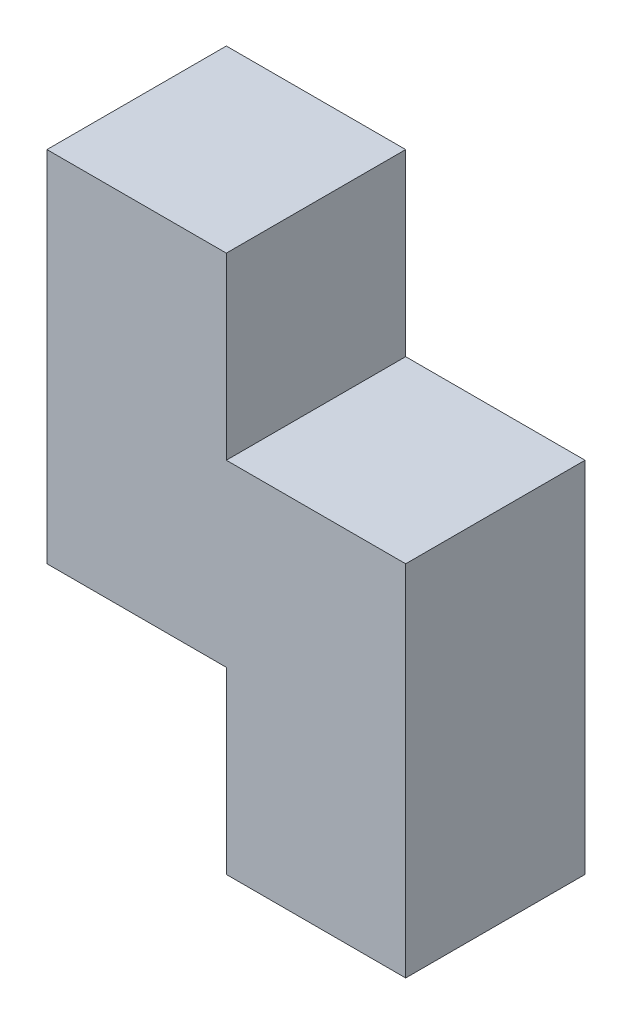
ISO-10303-21;
HEADER;
FILE_DESCRIPTION(('STEP AP214'),'2;1');
FILE_NAME('part.step','',(''),(''),'','','');
FILE_SCHEMA(('AUTOMOTIVE_DESIGN { 1 0 10303 214 1 1 1 1 }'));
ENDSEC;
DATA;
#1=APPLICATION_CONTEXT('core data for automotive mechanical design processes');
#2=APPLICATION_PROTOCOL_DEFINITION('international standard','automotive_design',2000,#1);
#3=PRODUCT_CONTEXT('',#1,'mechanical');
#4=PRODUCT('Part','Part','',(#3));
#5=PRODUCT_RELATED_PRODUCT_CATEGORY('part','',(#4));
#6=PRODUCT_DEFINITION_FORMATION('','',#4);
#7=PRODUCT_DEFINITION_CONTEXT('part definition',#1,'design');
#8=PRODUCT_DEFINITION('design','',#6,#7);
#9=PRODUCT_DEFINITION_SHAPE('','',#8);
#10=(LENGTH_UNIT() NAMED_UNIT(*) SI_UNIT(.MILLI.,.METRE.));
#11=(NAMED_UNIT(*) PLANE_ANGLE_UNIT() SI_UNIT($,.RADIAN.));
#12=(NAMED_UNIT(*) SI_UNIT($,.STERADIAN.) SOLID_ANGLE_UNIT());
#13=UNCERTAINTY_MEASURE_WITH_UNIT(LENGTH_MEASURE(1.E-05),#10,'distance_accuracy_value','');
#14=(GEOMETRIC_REPRESENTATION_CONTEXT(3) GLOBAL_UNCERTAINTY_ASSIGNED_CONTEXT((#13)) GLOBAL_UNIT_ASSIGNED_CONTEXT((#10,
#11,#12)) REPRESENTATION_CONTEXT('',''));
#15=CARTESIAN_POINT('',(0.,0.,0.));
#16=DIRECTION('',(0.,0.,1.));
#17=DIRECTION('',(1.,0.,0.));
#18=AXIS2_PLACEMENT_3D('',#15,#16,#17);
#19=CARTESIAN_POINT('',(19.888680700981,0.,30.));
#20=DIRECTION('',(-1.,0.,0.));
#21=DIRECTION('',(0.,0.,1.));
#22=AXIS2_PLACEMENT_3D('',#19,#20,#21);
#23=PLANE('',#22);
#24=DIRECTION('',(0.,1.,0.));
#25=VECTOR('',#24,1.);
#26=CARTESIAN_POINT('',(19.888680700981,0.,0.));
#27=LINE('',#26,#25);
#28=CARTESIAN_POINT('',(19.888680700981,0.,0.));
#29=VERTEX_POINT('',#28);
#30=CARTESIAN_POINT('',(19.888680700981,30.,0.));
#31=VERTEX_POINT('',#30);
#32=EDGE_CURVE('E148',#29,#31,#27,.T.);
#33=ORIENTED_EDGE('',*,*,#32,.T.);
#34=DIRECTION('',(0.,0.,-1.));
#35=VECTOR('',#34,1.);
#36=CARTESIAN_POINT('',(19.888680700981,30.,30.));
#37=LINE('',#36,#35);
#38=CARTESIAN_POINT('',(19.888680700981,30.,30.));
#39=VERTEX_POINT('',#38);
#40=EDGE_CURVE('E11',#39,#31,#37,.T.);
#41=ORIENTED_EDGE('',*,*,#40,.F.);
#42=DIRECTION('',(0.,1.,0.));
#43=VECTOR('',#42,1.);
#44=CARTESIAN_POINT('',(19.888680700981,0.,30.));
#45=LINE('',#44,#43);
#46=CARTESIAN_POINT('',(19.888680700981,0.,30.));
#47=VERTEX_POINT('',#46);
#48=EDGE_CURVE('E170',#47,#39,#45,.T.);
#49=ORIENTED_EDGE('',*,*,#48,.F.);
#50=DIRECTION('',(0.,0.,-1.));
#51=VECTOR('',#50,1.);
#52=CARTESIAN_POINT('',(19.888680700981,0.,30.));
#53=LINE('',#52,#51);
#54=EDGE_CURVE('E144',#47,#29,#53,.T.);
#55=ORIENTED_EDGE('',*,*,#54,.T.);
#56=EDGE_LOOP('',(#33,#41,#49,#55));
#57=FACE_BOUND('',#56,.T.);
#58=ADVANCED_FACE('F47',(#57),#23,.F.);
#59=CARTESIAN_POINT('',(0.,30.,30.));
#60=DIRECTION('',(0.,-1.,0.));
#61=DIRECTION('',(1.,0.,0.));
#62=AXIS2_PLACEMENT_3D('',#59,#60,#61);
#63=PLANE('',#62);
#64=DIRECTION('',(-1.,0.,0.));
#65=VECTOR('',#64,1.);
#66=CARTESIAN_POINT('',(0.,30.,0.));
#67=LINE('',#66,#65);
#68=CARTESIAN_POINT('',(-10.111319299019,30.,0.));
#69=VERTEX_POINT('',#68);
#70=EDGE_CURVE('E152',#31,#69,#67,.T.);
#71=ORIENTED_EDGE('',*,*,#70,.T.);
#72=DIRECTION('',(0.,0.,-1.));
#73=VECTOR('',#72,1.);
#74=CARTESIAN_POINT('',(-10.111319299019,30.,30.));
#75=LINE('',#74,#73);
#76=CARTESIAN_POINT('',(-10.111319299019,30.,30.));
#77=VERTEX_POINT('',#76);
#78=EDGE_CURVE('E56',#77,#69,#75,.T.);
#79=ORIENTED_EDGE('',*,*,#78,.F.);
#80=DIRECTION('',(-1.,0.,0.));
#81=VECTOR('',#80,1.);
#82=CARTESIAN_POINT('',(0.,30.,30.));
#83=LINE('',#82,#81);
#84=EDGE_CURVE('E107',#39,#77,#83,.T.);
#85=ORIENTED_EDGE('',*,*,#84,.F.);
#86=ORIENTED_EDGE('',*,*,#40,.T.);
#87=EDGE_LOOP('',(#71,#79,#85,#86));
#88=FACE_BOUND('',#87,.T.);
#89=ADVANCED_FACE('F216',(#88),#63,.F.);
#90=CARTESIAN_POINT('',(-10.111319299019,0.,30.));
#91=DIRECTION('',(1.,0.,0.));
#92=DIRECTION('',(0.,1.,0.));
#93=AXIS2_PLACEMENT_3D('',#90,#91,#92);
#94=PLANE('',#93);
#95=DIRECTION('',(0.,-1.,0.));
#96=VECTOR('',#95,1.);
#97=CARTESIAN_POINT('',(-10.111319299019,0.,0.));
#98=LINE('',#97,#96);
#99=CARTESIAN_POINT('',(-10.111319299019,-30.,0.));
#100=VERTEX_POINT('',#99);
#101=EDGE_CURVE('E155',#69,#100,#98,.T.);
#102=ORIENTED_EDGE('',*,*,#101,.T.);
#103=DIRECTION('',(0.,0.,-1.));
#104=VECTOR('',#103,1.);
#105=CARTESIAN_POINT('',(-10.111319299019,-30.,30.));
#106=LINE('',#105,#104);
#107=CARTESIAN_POINT('',(-10.111319299019,-30.,30.));
#108=VERTEX_POINT('',#107);
#109=EDGE_CURVE('E181',#108,#100,#106,.T.);
#110=ORIENTED_EDGE('',*,*,#109,.F.);
#111=DIRECTION('',(0.,-1.,0.));
#112=VECTOR('',#111,1.);
#113=CARTESIAN_POINT('',(-10.111319299019,0.,30.));
#114=LINE('',#113,#112);
#115=EDGE_CURVE('E191',#77,#108,#114,.T.);
#116=ORIENTED_EDGE('',*,*,#115,.F.);
#117=ORIENTED_EDGE('',*,*,#78,.T.);
#118=EDGE_LOOP('',(#102,#110,#116,#117));
#119=FACE_BOUND('',#118,.T.);
#120=ADVANCED_FACE('F189',(#119),#94,.F.);
#121=CARTESIAN_POINT('',(0.,-30.,30.));
#122=DIRECTION('',(0.,1.,0.));
#123=DIRECTION('',(-1.,0.,0.));
#124=AXIS2_PLACEMENT_3D('',#121,#122,#123);
#125=PLANE('',#124);
#126=DIRECTION('',(1.,0.,0.));
#127=VECTOR('',#126,1.);
#128=CARTESIAN_POINT('',(0.,-30.,0.));
#129=LINE('',#128,#127);
#130=CARTESIAN_POINT('',(19.888680700981,-30.,0.));
#131=VERTEX_POINT('',#130);
#132=EDGE_CURVE('E158',#100,#131,#129,.T.);
#133=ORIENTED_EDGE('',*,*,#132,.T.);
#134=DIRECTION('',(0.,0.,-1.));
#135=VECTOR('',#134,1.);
#136=CARTESIAN_POINT('',(19.888680700981,-30.,30.));
#137=LINE('',#136,#135);
#138=CARTESIAN_POINT('',(19.888680700981,-30.,30.));
#139=VERTEX_POINT('',#138);
#140=EDGE_CURVE('E177',#139,#131,#137,.T.);
#141=ORIENTED_EDGE('',*,*,#140,.F.);
#142=DIRECTION('',(1.,0.,0.));
#143=VECTOR('',#142,1.);
#144=CARTESIAN_POINT('',(0.,-30.,30.));
#145=LINE('',#144,#143);
#146=EDGE_CURVE('E204',#108,#139,#145,.T.);
#147=ORIENTED_EDGE('',*,*,#146,.F.);
#148=ORIENTED_EDGE('',*,*,#109,.T.);
#149=EDGE_LOOP('',(#133,#141,#147,#148));
#150=FACE_BOUND('',#149,.T.);
#151=ADVANCED_FACE('F199',(#150),#125,.F.);
#152=CARTESIAN_POINT('',(19.888680700981,0.,30.));
#153=DIRECTION('',(1.,0.,0.));
#154=DIRECTION('',(0.,0.,-1.));
#155=AXIS2_PLACEMENT_3D('',#152,#153,#154);
#156=PLANE('',#155);
#157=DIRECTION('',(0.,-1.,0.));
#158=VECTOR('',#157,1.);
#159=CARTESIAN_POINT('',(19.888680700981,0.,0.));
#160=LINE('',#159,#158);
#161=CARTESIAN_POINT('',(19.888680700981,-60.,0.));
#162=VERTEX_POINT('',#161);
#163=EDGE_CURVE('E161',#131,#162,#160,.T.);
#164=ORIENTED_EDGE('',*,*,#163,.T.);
#165=DIRECTION('',(0.,0.,-1.));
#166=VECTOR('',#165,1.);
#167=CARTESIAN_POINT('',(19.888680700981,-60.,30.));
#168=LINE('',#167,#166);
#169=CARTESIAN_POINT('',(19.888680700981,-60.,30.));
#170=VERTEX_POINT('',#169);
#171=EDGE_CURVE('E137',#170,#162,#168,.T.);
#172=ORIENTED_EDGE('',*,*,#171,.F.);
#173=DIRECTION('',(0.,-1.,0.));
#174=VECTOR('',#173,1.);
#175=CARTESIAN_POINT('',(19.888680700981,0.,30.));
#176=LINE('',#175,#174);
#177=EDGE_CURVE('E126',#139,#170,#176,.T.);
#178=ORIENTED_EDGE('',*,*,#177,.F.);
#179=ORIENTED_EDGE('',*,*,#140,.T.);
#180=EDGE_LOOP('',(#164,#172,#178,#179));
#181=FACE_BOUND('',#180,.T.);
#182=ADVANCED_FACE('F202',(#181),#156,.F.);
#183=CARTESIAN_POINT('',(0.,-60.,30.));
#184=DIRECTION('',(0.,1.,0.));
#185=DIRECTION('',(0.,0.,1.));
#186=AXIS2_PLACEMENT_3D('',#183,#184,#185);
#187=PLANE('',#186);
#188=DIRECTION('',(1.,0.,0.));
#189=VECTOR('',#188,1.);
#190=CARTESIAN_POINT('',(0.,-60.,0.));
#191=LINE('',#190,#189);
#192=CARTESIAN_POINT('',(49.888680700981,-60.,0.));
#193=VERTEX_POINT('',#192);
#194=EDGE_CURVE('E135',#162,#193,#191,.T.);
#195=ORIENTED_EDGE('',*,*,#194,.T.);
#196=DIRECTION('',(0.,0.,-1.));
#197=VECTOR('',#196,1.);
#198=CARTESIAN_POINT('',(49.888680700981,-60.,30.));
#199=LINE('',#198,#197);
#200=CARTESIAN_POINT('',(49.888680700981,-60.,30.));
#201=VERTEX_POINT('',#200);
#202=EDGE_CURVE('E132',#201,#193,#199,.T.);
#203=ORIENTED_EDGE('',*,*,#202,.F.);
#204=DIRECTION('',(1.,0.,0.));
#205=VECTOR('',#204,1.);
#206=CARTESIAN_POINT('',(0.,-60.,30.));
#207=LINE('',#206,#205);
#208=EDGE_CURVE('E120',#170,#201,#207,.T.);
#209=ORIENTED_EDGE('',*,*,#208,.F.);
#210=ORIENTED_EDGE('',*,*,#171,.T.);
#211=EDGE_LOOP('',(#195,#203,#209,#210));
#212=FACE_BOUND('',#211,.T.);
#213=ADVANCED_FACE('F133',(#212),#187,.F.);
#214=CARTESIAN_POINT('',(49.888680700981,0.,30.));
#215=DIRECTION('',(-1.,0.,0.));
#216=DIRECTION('',(0.,0.,1.));
#217=AXIS2_PLACEMENT_3D('',#214,#215,#216);
#218=PLANE('',#217);
#219=DIRECTION('',(0.,1.,0.));
#220=VECTOR('',#219,1.);
#221=CARTESIAN_POINT('',(49.888680700981,0.,0.));
#222=LINE('',#221,#220);
#223=CARTESIAN_POINT('',(49.888680700981,0.,0.));
#224=VERTEX_POINT('',#223);
#225=EDGE_CURVE('E93',#193,#224,#222,.T.);
#226=ORIENTED_EDGE('',*,*,#225,.T.);
#227=DIRECTION('',(0.,0.,-1.));
#228=VECTOR('',#227,1.);
#229=CARTESIAN_POINT('',(49.888680700981,0.,30.));
#230=LINE('',#229,#228);
#231=CARTESIAN_POINT('',(49.888680700981,0.,30.));
#232=VERTEX_POINT('',#231);
#233=EDGE_CURVE('E138',#232,#224,#230,.T.);
#234=ORIENTED_EDGE('',*,*,#233,.F.);
#235=DIRECTION('',(0.,1.,0.));
#236=VECTOR('',#235,1.);
#237=CARTESIAN_POINT('',(49.888680700981,0.,30.));
#238=LINE('',#237,#236);
#239=EDGE_CURVE('E124',#201,#232,#238,.T.);
#240=ORIENTED_EDGE('',*,*,#239,.F.);
#241=ORIENTED_EDGE('',*,*,#202,.T.);
#242=EDGE_LOOP('',(#226,#234,#240,#241));
#243=FACE_BOUND('',#242,.T.);
#244=ADVANCED_FACE('F140',(#243),#218,.F.);
#245=CARTESIAN_POINT('',(0.,0.,30.));
#246=DIRECTION('',(0.,-1.,0.));
#247=DIRECTION('',(1.,0.,0.));
#248=AXIS2_PLACEMENT_3D('',#245,#246,#247);
#249=PLANE('',#248);
#250=DIRECTION('',(-1.,0.,0.));
#251=VECTOR('',#250,1.);
#252=CARTESIAN_POINT('',(0.,0.,0.));
#253=LINE('',#252,#251);
#254=EDGE_CURVE('E99',#224,#29,#253,.T.);
#255=ORIENTED_EDGE('',*,*,#254,.T.);
#256=ORIENTED_EDGE('',*,*,#54,.F.);
#257=DIRECTION('',(-1.,0.,0.));
#258=VECTOR('',#257,1.);
#259=CARTESIAN_POINT('',(0.,0.,30.));
#260=LINE('',#259,#258);
#261=EDGE_CURVE('E64',#232,#47,#260,.T.);
#262=ORIENTED_EDGE('',*,*,#261,.F.);
#263=ORIENTED_EDGE('',*,*,#233,.T.);
#264=EDGE_LOOP('',(#255,#256,#262,#263));
#265=FACE_BOUND('',#264,.T.);
#266=ADVANCED_FACE('F232',(#265),#249,.F.);
#267=CARTESIAN_POINT('',(0.,0.,30.));
#268=DIRECTION('',(0.,0.,1.));
#269=DIRECTION('',(1.,0.,0.));
#270=AXIS2_PLACEMENT_3D('',#267,#268,#269);
#271=PLANE('',#270);
#272=ORIENTED_EDGE('',*,*,#48,.T.);
#273=ORIENTED_EDGE('',*,*,#84,.T.);
#274=ORIENTED_EDGE('',*,*,#115,.T.);
#275=ORIENTED_EDGE('',*,*,#146,.T.);
#276=ORIENTED_EDGE('',*,*,#177,.T.);
#277=ORIENTED_EDGE('',*,*,#208,.T.);
#278=ORIENTED_EDGE('',*,*,#239,.T.);
#279=ORIENTED_EDGE('',*,*,#261,.T.);
#280=EDGE_LOOP('',(#272,#273,#274,#275,#276,#277,#278,#279));
#281=FACE_BOUND('',#280,.T.);
#282=ADVANCED_FACE('F122',(#281),#271,.T.);
#283=CARTESIAN_POINT('',(0.,0.,0.));
#284=DIRECTION('',(0.,0.,1.));
#285=DIRECTION('',(1.,0.,0.));
#286=AXIS2_PLACEMENT_3D('',#283,#284,#285);
#287=PLANE('',#286);
#288=ORIENTED_EDGE('',*,*,#32,.F.);
#289=ORIENTED_EDGE('',*,*,#254,.F.);
#290=ORIENTED_EDGE('',*,*,#225,.F.);
#291=ORIENTED_EDGE('',*,*,#194,.F.);
#292=ORIENTED_EDGE('',*,*,#163,.F.);
#293=ORIENTED_EDGE('',*,*,#132,.F.);
#294=ORIENTED_EDGE('',*,*,#101,.F.);
#295=ORIENTED_EDGE('',*,*,#70,.F.);
#296=EDGE_LOOP('',(#288,#289,#290,#291,#292,#293,#294,#295));
#297=FACE_BOUND('',#296,.T.);
#298=ADVANCED_FACE('F195',(#297),#287,.F.);
#299=CLOSED_SHELL('',(#58,#89,#120,#151,#182,#213,#244,#266,#282,#298));
#300=MANIFOLD_SOLID_BREP('B2',#299);
#301=ADVANCED_BREP_SHAPE_REPRESENTATION('',(#18,#300),#14);
#302=SHAPE_DEFINITION_REPRESENTATION(#9,#301);
ENDSEC;
END-ISO-10303-21;
